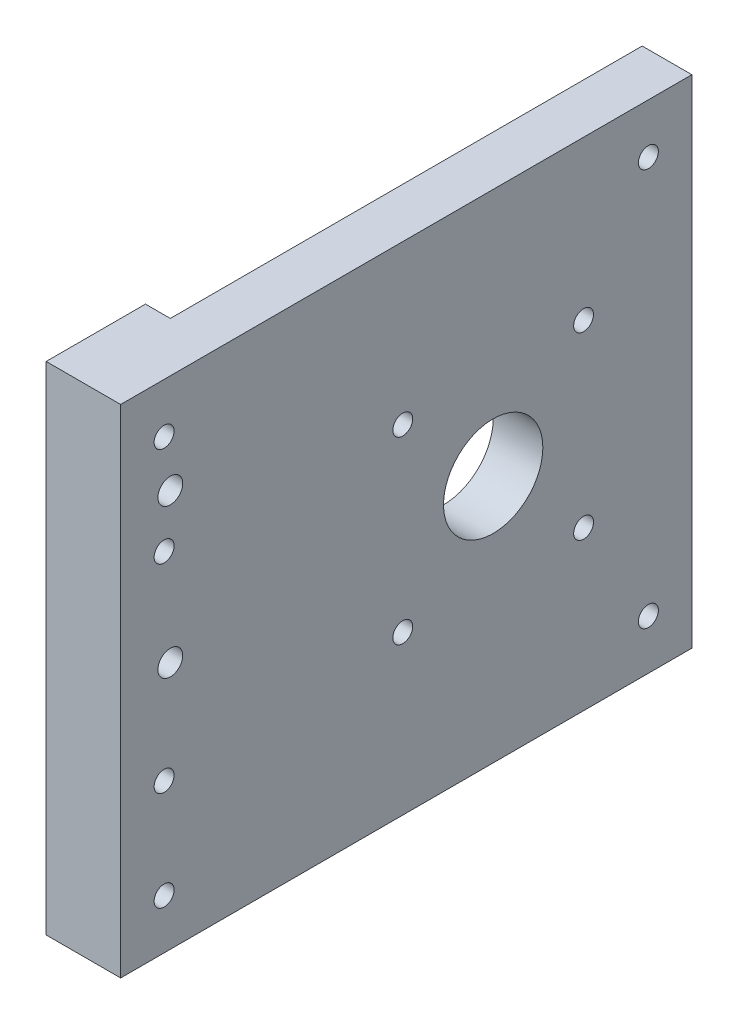
ISO-10303-21;
HEADER;
FILE_DESCRIPTION(('STEP AP214'),'2;1');
FILE_NAME('part.step','',(''),(''),'','','');
FILE_SCHEMA(('AUTOMOTIVE_DESIGN { 1 0 10303 214 1 1 1 1 }'));
ENDSEC;
DATA;
#1=APPLICATION_CONTEXT('core data for automotive mechanical design processes');
#2=APPLICATION_PROTOCOL_DEFINITION('international standard','automotive_design',2000,#1);
#3=PRODUCT_CONTEXT('',#1,'mechanical');
#4=PRODUCT('Part','Part','',(#3));
#5=PRODUCT_RELATED_PRODUCT_CATEGORY('part','',(#4));
#6=PRODUCT_DEFINITION_FORMATION('','',#4);
#7=PRODUCT_DEFINITION_CONTEXT('part definition',#1,'design');
#8=PRODUCT_DEFINITION('design','',#6,#7);
#9=PRODUCT_DEFINITION_SHAPE('','',#8);
#10=(LENGTH_UNIT() NAMED_UNIT(*) SI_UNIT(.MILLI.,.METRE.));
#11=(NAMED_UNIT(*) PLANE_ANGLE_UNIT() SI_UNIT($,.RADIAN.));
#12=(NAMED_UNIT(*) SI_UNIT($,.STERADIAN.) SOLID_ANGLE_UNIT());
#13=UNCERTAINTY_MEASURE_WITH_UNIT(LENGTH_MEASURE(1.E-05),#10,'distance_accuracy_value','');
#14=(GEOMETRIC_REPRESENTATION_CONTEXT(3) GLOBAL_UNCERTAINTY_ASSIGNED_CONTEXT((#13)) GLOBAL_UNIT_ASSIGNED_CONTEXT((#10,
#11,#12)) REPRESENTATION_CONTEXT('',''));
#15=CARTESIAN_POINT('',(0.,0.,0.));
#16=DIRECTION('',(0.,0.,1.));
#17=DIRECTION('',(1.,0.,0.));
#18=AXIS2_PLACEMENT_3D('',#15,#16,#17);
#19=CARTESIAN_POINT('',(0.,0.,146.05));
#20=DIRECTION('',(1.,0.,0.));
#21=DIRECTION('',(0.,0.,-1.));
#22=AXIS2_PLACEMENT_3D('',#19,#20,#21);
#23=PLANE('',#22);
#24=CARTESIAN_POINT('',(0.,114.3,11.1125));
#25=DIRECTION('',(-1.,0.,0.));
#26=DIRECTION('',(0.,0.,1.));
#27=AXIS2_PLACEMENT_3D('',#24,#25,#26);
#28=CIRCLE('',#27,2.55269999999999);
#29=CARTESIAN_POINT('',(0.,114.3,13.6652));
#30=VERTEX_POINT('',#29);
#31=EDGE_CURVE('E205',#30,#30,#28,.T.);
#32=ORIENTED_EDGE('',*,*,#31,.F.);
#33=EDGE_LOOP('',(#32));
#34=FACE_BOUND('',#33,.T.);
#35=CARTESIAN_POINT('',(0.,12.7,11.1125));
#36=DIRECTION('',(-1.,0.,0.));
#37=DIRECTION('',(0.,0.,1.));
#38=AXIS2_PLACEMENT_3D('',#35,#36,#37);
#39=CIRCLE('',#38,2.55269999999999);
#40=CARTESIAN_POINT('',(0.,12.7,13.6652));
#41=VERTEX_POINT('',#40);
#42=EDGE_CURVE('E209',#41,#41,#39,.T.);
#43=ORIENTED_EDGE('',*,*,#42,.F.);
#44=EDGE_LOOP('',(#43));
#45=FACE_BOUND('',#44,.T.);
#46=CARTESIAN_POINT('',(0.,40.513,73.914));
#47=DIRECTION('',(1.,0.,0.));
#48=DIRECTION('',(0.,0.,-1.));
#49=AXIS2_PLACEMENT_3D('',#46,#47,#48);
#50=CIRCLE('',#49,2.54);
#51=CARTESIAN_POINT('',(0.,40.513,71.374));
#52=VERTEX_POINT('',#51);
#53=EDGE_CURVE('E177',#52,#52,#50,.F.);
#54=ORIENTED_EDGE('',*,*,#53,.F.);
#55=EDGE_LOOP('',(#54));
#56=FACE_BOUND('',#55,.T.);
#57=CARTESIAN_POINT('',(0.,40.513,27.686));
#58=DIRECTION('',(1.,0.,0.));
#59=DIRECTION('',(0.,0.,-1.));
#60=AXIS2_PLACEMENT_3D('',#57,#58,#59);
#61=CIRCLE('',#60,2.54);
#62=CARTESIAN_POINT('',(0.,40.513,25.146));
#63=VERTEX_POINT('',#62);
#64=EDGE_CURVE('E171',#63,#63,#61,.F.);
#65=ORIENTED_EDGE('',*,*,#64,.F.);
#66=EDGE_LOOP('',(#65));
#67=FACE_BOUND('',#66,.T.);
#68=CARTESIAN_POINT('',(0.,86.487,27.686));
#69=DIRECTION('',(1.,0.,0.));
#70=DIRECTION('',(0.,0.,-1.));
#71=AXIS2_PLACEMENT_3D('',#68,#69,#70);
#72=CIRCLE('',#71,2.53999999999999);
#73=CARTESIAN_POINT('',(0.,86.487,25.146));
#74=VERTEX_POINT('',#73);
#75=EDGE_CURVE('E165',#74,#74,#72,.F.);
#76=ORIENTED_EDGE('',*,*,#75,.F.);
#77=EDGE_LOOP('',(#76));
#78=FACE_BOUND('',#77,.T.);
#79=CARTESIAN_POINT('',(0.,86.487,73.914));
#80=DIRECTION('',(1.,0.,0.));
#81=DIRECTION('',(0.,0.,-1.));
#82=AXIS2_PLACEMENT_3D('',#79,#80,#81);
#83=CIRCLE('',#82,2.53999999999999);
#84=CARTESIAN_POINT('',(0.,86.487,71.374));
#85=VERTEX_POINT('',#84);
#86=EDGE_CURVE('E159',#85,#85,#83,.F.);
#87=ORIENTED_EDGE('',*,*,#86,.F.);
#88=EDGE_LOOP('',(#87));
#89=FACE_BOUND('',#88,.T.);
#90=CARTESIAN_POINT('',(0.,63.5,50.8));
#91=DIRECTION('',(1.,0.,0.));
#92=DIRECTION('',(0.,0.,-1.));
#93=AXIS2_PLACEMENT_3D('',#90,#91,#92);
#94=CIRCLE('',#93,12.7);
#95=CARTESIAN_POINT('',(0.,63.5,38.1));
#96=VERTEX_POINT('',#95);
#97=EDGE_CURVE('E155',#96,#96,#94,.F.);
#98=ORIENTED_EDGE('',*,*,#97,.F.);
#99=EDGE_LOOP('',(#98));
#100=FACE_BOUND('',#99,.T.);
#101=DIRECTION('',(0.,-1.,0.));
#102=VECTOR('',#101,1.);
#103=CARTESIAN_POINT('',(0.,127.,120.65));
#104=LINE('',#103,#102);
#105=CARTESIAN_POINT('',(0.,127.,120.65));
#106=VERTEX_POINT('',#105);
#107=CARTESIAN_POINT('',(0.,0.,120.65));
#108=VERTEX_POINT('',#107);
#109=EDGE_CURVE('E50',#106,#108,#104,.T.);
#110=ORIENTED_EDGE('',*,*,#109,.F.);
#111=DIRECTION('',(0.,0.,-1.));
#112=VECTOR('',#111,1.);
#113=CARTESIAN_POINT('',(0.,127.,146.05));
#114=LINE('',#113,#112);
#115=CARTESIAN_POINT('',(0.,127.,0.));
#116=VERTEX_POINT('',#115);
#117=EDGE_CURVE('E74',#106,#116,#114,.T.);
#118=ORIENTED_EDGE('',*,*,#117,.T.);
#119=DIRECTION('',(0.,-1.,0.));
#120=VECTOR('',#119,1.);
#121=CARTESIAN_POINT('',(0.,0.,0.));
#122=LINE('',#121,#120);
#123=CARTESIAN_POINT('',(0.,0.,0.));
#124=VERTEX_POINT('',#123);
#125=EDGE_CURVE('E77',#116,#124,#122,.T.);
#126=ORIENTED_EDGE('',*,*,#125,.T.);
#127=DIRECTION('',(0.,0.,-1.));
#128=VECTOR('',#127,1.);
#129=CARTESIAN_POINT('',(0.,0.,146.05));
#130=LINE('',#129,#128);
#131=EDGE_CURVE('E11',#108,#124,#130,.T.);
#132=ORIENTED_EDGE('',*,*,#131,.F.);
#133=EDGE_LOOP('',(#110,#118,#126,#132));
#134=FACE_BOUND('',#133,.T.);
#135=ADVANCED_FACE('F36',(#34,#45,#56,#67,#78,#89,#100,#134),#23,.F.);
#136=CARTESIAN_POINT('',(0.,0.,146.05));
#137=DIRECTION('',(0.,1.,0.));
#138=DIRECTION('',(0.,0.,1.));
#139=AXIS2_PLACEMENT_3D('',#136,#137,#138);
#140=PLANE('',#139);
#141=DIRECTION('',(1.,0.,0.));
#142=VECTOR('',#141,1.);
#143=CARTESIAN_POINT('',(0.,0.,0.));
#144=LINE('',#143,#142);
#145=CARTESIAN_POINT('',(12.7,0.,0.));
#146=VERTEX_POINT('',#145);
#147=EDGE_CURVE('E96',#124,#146,#144,.T.);
#148=ORIENTED_EDGE('',*,*,#147,.T.);
#149=DIRECTION('',(0.,0.,-1.));
#150=VECTOR('',#149,1.);
#151=CARTESIAN_POINT('',(12.7,0.,146.05));
#152=LINE('',#151,#150);
#153=CARTESIAN_POINT('',(12.7,0.,146.05));
#154=VERTEX_POINT('',#153);
#155=EDGE_CURVE('E43',#154,#146,#152,.T.);
#156=ORIENTED_EDGE('',*,*,#155,.F.);
#157=DIRECTION('',(1.,0.,0.));
#158=VECTOR('',#157,1.);
#159=CARTESIAN_POINT('',(0.,0.,146.05));
#160=LINE('',#159,#158);
#161=CARTESIAN_POINT('',(-6.35,0.,146.05));
#162=VERTEX_POINT('',#161);
#163=EDGE_CURVE('E91',#162,#154,#160,.T.);
#164=ORIENTED_EDGE('',*,*,#163,.F.);
#165=DIRECTION('',(0.,0.,-1.));
#166=VECTOR('',#165,1.);
#167=CARTESIAN_POINT('',(-6.35,0.,146.05));
#168=LINE('',#167,#166);
#169=CARTESIAN_POINT('',(-6.35,0.,120.65));
#170=VERTEX_POINT('',#169);
#171=EDGE_CURVE('E144',#162,#170,#168,.T.);
#172=ORIENTED_EDGE('',*,*,#171,.T.);
#173=DIRECTION('',(1.,0.,0.));
#174=VECTOR('',#173,1.);
#175=CARTESIAN_POINT('',(-6.35,0.,120.65));
#176=LINE('',#175,#174);
#177=EDGE_CURVE('E119',#170,#108,#176,.T.);
#178=ORIENTED_EDGE('',*,*,#177,.T.);
#179=ORIENTED_EDGE('',*,*,#131,.T.);
#180=EDGE_LOOP('',(#148,#156,#164,#172,#178,#179));
#181=FACE_BOUND('',#180,.T.);
#182=ADVANCED_FACE('F113',(#181),#140,.F.);
#183=CARTESIAN_POINT('',(12.7,0.,146.05));
#184=DIRECTION('',(-1.,0.,0.));
#185=DIRECTION('',(0.,0.,1.));
#186=AXIS2_PLACEMENT_3D('',#183,#184,#185);
#187=PLANE('',#186);
#188=CARTESIAN_POINT('',(12.7,114.3,134.9375));
#189=DIRECTION('',(-1.,0.,0.));
#190=DIRECTION('',(0.,0.,1.));
#191=AXIS2_PLACEMENT_3D('',#188,#189,#190);
#192=CIRCLE('',#191,2.55269999999999);
#193=CARTESIAN_POINT('',(12.7,114.3,137.4902));
#194=VERTEX_POINT('',#193);
#195=EDGE_CURVE('E296',#194,#194,#192,.T.);
#196=ORIENTED_EDGE('',*,*,#195,.T.);
#197=EDGE_LOOP('',(#196));
#198=FACE_BOUND('',#197,.T.);
#199=CARTESIAN_POINT('',(12.7,88.9,134.9375));
#200=DIRECTION('',(-1.,0.,0.));
#201=DIRECTION('',(0.,0.,1.));
#202=AXIS2_PLACEMENT_3D('',#199,#200,#201);
#203=CIRCLE('',#202,2.55269999999999);
#204=CARTESIAN_POINT('',(12.7,88.9,137.4902));
#205=VERTEX_POINT('',#204);
#206=EDGE_CURVE('E306',#205,#205,#203,.T.);
#207=ORIENTED_EDGE('',*,*,#206,.T.);
#208=EDGE_LOOP('',(#207));
#209=FACE_BOUND('',#208,.T.);
#210=CARTESIAN_POINT('',(12.7,38.1,134.9375));
#211=DIRECTION('',(-1.,0.,0.));
#212=DIRECTION('',(0.,0.,1.));
#213=AXIS2_PLACEMENT_3D('',#210,#211,#212);
#214=CIRCLE('',#213,2.5527);
#215=CARTESIAN_POINT('',(12.7,38.1,137.4902));
#216=VERTEX_POINT('',#215);
#217=EDGE_CURVE('E312',#216,#216,#214,.T.);
#218=ORIENTED_EDGE('',*,*,#217,.T.);
#219=EDGE_LOOP('',(#218));
#220=FACE_BOUND('',#219,.T.);
#221=CARTESIAN_POINT('',(12.7,12.7,134.9375));
#222=DIRECTION('',(-1.,0.,0.));
#223=DIRECTION('',(0.,0.,1.));
#224=AXIS2_PLACEMENT_3D('',#221,#222,#223);
#225=CIRCLE('',#224,2.5527);
#226=CARTESIAN_POINT('',(12.7,12.7,137.4902));
#227=VERTEX_POINT('',#226);
#228=EDGE_CURVE('E318',#227,#227,#225,.T.);
#229=ORIENTED_EDGE('',*,*,#228,.T.);
#230=EDGE_LOOP('',(#229));
#231=FACE_BOUND('',#230,.T.);
#232=CARTESIAN_POINT('',(12.7,114.3,11.1125));
#233=DIRECTION('',(-1.,0.,0.));
#234=DIRECTION('',(0.,0.,1.));
#235=AXIS2_PLACEMENT_3D('',#232,#233,#234);
#236=CIRCLE('',#235,2.55269999999999);
#237=CARTESIAN_POINT('',(12.7,114.3,13.6652));
#238=VERTEX_POINT('',#237);
#239=EDGE_CURVE('E322',#238,#238,#236,.T.);
#240=ORIENTED_EDGE('',*,*,#239,.T.);
#241=EDGE_LOOP('',(#240));
#242=FACE_BOUND('',#241,.T.);
#243=CARTESIAN_POINT('',(12.7,12.7,11.1125));
#244=DIRECTION('',(-1.,0.,0.));
#245=DIRECTION('',(0.,0.,1.));
#246=AXIS2_PLACEMENT_3D('',#243,#244,#245);
#247=CIRCLE('',#246,2.5527);
#248=CARTESIAN_POINT('',(12.7,12.7,13.6652));
#249=VERTEX_POINT('',#248);
#250=EDGE_CURVE('E326',#249,#249,#247,.T.);
#251=ORIENTED_EDGE('',*,*,#250,.T.);
#252=EDGE_LOOP('',(#251));
#253=FACE_BOUND('',#252,.T.);
#254=CARTESIAN_POINT('',(12.7,101.6,133.35));
#255=DIRECTION('',(1.,0.,0.));
#256=DIRECTION('',(0.,0.,-1.));
#257=AXIS2_PLACEMENT_3D('',#254,#255,#256);
#258=CIRCLE('',#257,3.175);
#259=CARTESIAN_POINT('',(12.7,101.6,130.175));
#260=VERTEX_POINT('',#259);
#261=EDGE_CURVE('E97',#260,#260,#258,.T.);
#262=ORIENTED_EDGE('',*,*,#261,.F.);
#263=EDGE_LOOP('',(#262));
#264=FACE_BOUND('',#263,.T.);
#265=CARTESIAN_POINT('',(12.7,63.5,133.35));
#266=DIRECTION('',(1.,0.,0.));
#267=DIRECTION('',(0.,0.,-1.));
#268=AXIS2_PLACEMENT_3D('',#265,#266,#267);
#269=CIRCLE('',#268,3.175);
#270=CARTESIAN_POINT('',(12.7,63.5,130.175));
#271=VERTEX_POINT('',#270);
#272=EDGE_CURVE('E101',#271,#271,#269,.T.);
#273=ORIENTED_EDGE('',*,*,#272,.F.);
#274=EDGE_LOOP('',(#273));
#275=FACE_BOUND('',#274,.T.);
#276=CARTESIAN_POINT('',(12.7,63.5,50.8));
#277=DIRECTION('',(1.,0.,0.));
#278=DIRECTION('',(0.,0.,-1.));
#279=AXIS2_PLACEMENT_3D('',#276,#277,#278);
#280=CIRCLE('',#279,12.7);
#281=CARTESIAN_POINT('',(12.7,63.5,38.1));
#282=VERTEX_POINT('',#281);
#283=EDGE_CURVE('E156',#282,#282,#280,.T.);
#284=ORIENTED_EDGE('',*,*,#283,.F.);
#285=EDGE_LOOP('',(#284));
#286=FACE_BOUND('',#285,.T.);
#287=CARTESIAN_POINT('',(12.7,86.487,73.914));
#288=DIRECTION('',(1.,0.,0.));
#289=DIRECTION('',(0.,0.,-1.));
#290=AXIS2_PLACEMENT_3D('',#287,#288,#289);
#291=CIRCLE('',#290,2.53999999999999);
#292=CARTESIAN_POINT('',(12.7,86.487,71.374));
#293=VERTEX_POINT('',#292);
#294=EDGE_CURVE('E162',#293,#293,#291,.T.);
#295=ORIENTED_EDGE('',*,*,#294,.F.);
#296=EDGE_LOOP('',(#295));
#297=FACE_BOUND('',#296,.T.);
#298=CARTESIAN_POINT('',(12.7,86.487,27.686));
#299=DIRECTION('',(1.,0.,0.));
#300=DIRECTION('',(0.,0.,-1.));
#301=AXIS2_PLACEMENT_3D('',#298,#299,#300);
#302=CIRCLE('',#301,2.53999999999999);
#303=CARTESIAN_POINT('',(12.7,86.487,25.146));
#304=VERTEX_POINT('',#303);
#305=EDGE_CURVE('E168',#304,#304,#302,.T.);
#306=ORIENTED_EDGE('',*,*,#305,.F.);
#307=EDGE_LOOP('',(#306));
#308=FACE_BOUND('',#307,.T.);
#309=CARTESIAN_POINT('',(12.7,40.513,27.686));
#310=DIRECTION('',(1.,0.,0.));
#311=DIRECTION('',(0.,0.,-1.));
#312=AXIS2_PLACEMENT_3D('',#309,#310,#311);
#313=CIRCLE('',#312,2.54);
#314=CARTESIAN_POINT('',(12.7,40.513,25.146));
#315=VERTEX_POINT('',#314);
#316=EDGE_CURVE('E174',#315,#315,#313,.T.);
#317=ORIENTED_EDGE('',*,*,#316,.F.);
#318=EDGE_LOOP('',(#317));
#319=FACE_BOUND('',#318,.T.);
#320=CARTESIAN_POINT('',(12.7,40.513,73.914));
#321=DIRECTION('',(1.,0.,0.));
#322=DIRECTION('',(0.,0.,-1.));
#323=AXIS2_PLACEMENT_3D('',#320,#321,#322);
#324=CIRCLE('',#323,2.54);
#325=CARTESIAN_POINT('',(12.7,40.513,71.374));
#326=VERTEX_POINT('',#325);
#327=EDGE_CURVE('E141',#326,#326,#324,.T.);
#328=ORIENTED_EDGE('',*,*,#327,.F.);
#329=EDGE_LOOP('',(#328));
#330=FACE_BOUND('',#329,.T.);
#331=DIRECTION('',(0.,1.,0.));
#332=VECTOR('',#331,1.);
#333=CARTESIAN_POINT('',(12.7,0.,0.));
#334=LINE('',#333,#332);
#335=CARTESIAN_POINT('',(12.7,127.,0.));
#336=VERTEX_POINT('',#335);
#337=EDGE_CURVE('E92',#146,#336,#334,.T.);
#338=ORIENTED_EDGE('',*,*,#337,.T.);
#339=DIRECTION('',(0.,0.,-1.));
#340=VECTOR('',#339,1.);
#341=CARTESIAN_POINT('',(12.7,127.,146.05));
#342=LINE('',#341,#340);
#343=CARTESIAN_POINT('',(12.7,127.,146.05));
#344=VERTEX_POINT('',#343);
#345=EDGE_CURVE('E81',#344,#336,#342,.T.);
#346=ORIENTED_EDGE('',*,*,#345,.F.);
#347=DIRECTION('',(0.,1.,0.));
#348=VECTOR('',#347,1.);
#349=CARTESIAN_POINT('',(12.7,0.,146.05));
#350=LINE('',#349,#348);
#351=EDGE_CURVE('E59',#154,#344,#350,.T.);
#352=ORIENTED_EDGE('',*,*,#351,.F.);
#353=ORIENTED_EDGE('',*,*,#155,.T.);
#354=EDGE_LOOP('',(#338,#346,#352,#353));
#355=FACE_BOUND('',#354,.T.);
#356=ADVANCED_FACE('F110',(#198,#209,#220,#231,#242,#253,#264,#275,#286,#297,#308,#319,#330,
#355),#187,.F.);
#357=CARTESIAN_POINT('',(0.,127.,146.05));
#358=DIRECTION('',(0.,-1.,0.));
#359=DIRECTION('',(0.,0.,-1.));
#360=AXIS2_PLACEMENT_3D('',#357,#358,#359);
#361=PLANE('',#360);
#362=DIRECTION('',(-1.,0.,0.));
#363=VECTOR('',#362,1.);
#364=CARTESIAN_POINT('',(0.,127.,0.));
#365=LINE('',#364,#363);
#366=EDGE_CURVE('E86',#336,#116,#365,.T.);
#367=ORIENTED_EDGE('',*,*,#366,.T.);
#368=ORIENTED_EDGE('',*,*,#117,.F.);
#369=DIRECTION('',(1.,0.,0.));
#370=VECTOR('',#369,1.);
#371=CARTESIAN_POINT('',(-6.35,127.,120.65));
#372=LINE('',#371,#370);
#373=CARTESIAN_POINT('',(-6.35,127.,120.65));
#374=VERTEX_POINT('',#373);
#375=EDGE_CURVE('E139',#374,#106,#372,.T.);
#376=ORIENTED_EDGE('',*,*,#375,.F.);
#377=DIRECTION('',(0.,0.,-1.));
#378=VECTOR('',#377,1.);
#379=CARTESIAN_POINT('',(-6.35,127.,146.05));
#380=LINE('',#379,#378);
#381=CARTESIAN_POINT('',(-6.35,127.,146.05));
#382=VERTEX_POINT('',#381);
#383=EDGE_CURVE('E132',#382,#374,#380,.T.);
#384=ORIENTED_EDGE('',*,*,#383,.F.);
#385=DIRECTION('',(-1.,0.,0.));
#386=VECTOR('',#385,1.);
#387=CARTESIAN_POINT('',(0.,127.,146.05));
#388=LINE('',#387,#386);
#389=EDGE_CURVE('E82',#344,#382,#388,.T.);
#390=ORIENTED_EDGE('',*,*,#389,.F.);
#391=ORIENTED_EDGE('',*,*,#345,.T.);
#392=EDGE_LOOP('',(#367,#368,#376,#384,#390,#391));
#393=FACE_BOUND('',#392,.T.);
#394=ADVANCED_FACE('F87',(#393),#361,.F.);
#395=CARTESIAN_POINT('',(0.,0.,146.05));
#396=DIRECTION('',(0.,0.,-1.));
#397=DIRECTION('',(-1.,0.,0.));
#398=AXIS2_PLACEMENT_3D('',#395,#396,#397);
#399=PLANE('',#398);
#400=ORIENTED_EDGE('',*,*,#389,.T.);
#401=DIRECTION('',(0.,-1.,0.));
#402=VECTOR('',#401,1.);
#403=CARTESIAN_POINT('',(-6.35,127.,146.05));
#404=LINE('',#403,#402);
#405=EDGE_CURVE('E137',#382,#162,#404,.T.);
#406=ORIENTED_EDGE('',*,*,#405,.T.);
#407=ORIENTED_EDGE('',*,*,#163,.T.);
#408=ORIENTED_EDGE('',*,*,#351,.T.);
#409=EDGE_LOOP('',(#400,#406,#407,#408));
#410=FACE_BOUND('',#409,.T.);
#411=ADVANCED_FACE('F184',(#410),#399,.F.);
#412=CARTESIAN_POINT('',(0.,0.,0.));
#413=DIRECTION('',(0.,0.,-1.));
#414=DIRECTION('',(-1.,0.,0.));
#415=AXIS2_PLACEMENT_3D('',#412,#413,#414);
#416=PLANE('',#415);
#417=ORIENTED_EDGE('',*,*,#125,.F.);
#418=ORIENTED_EDGE('',*,*,#366,.F.);
#419=ORIENTED_EDGE('',*,*,#337,.F.);
#420=ORIENTED_EDGE('',*,*,#147,.F.);
#421=EDGE_LOOP('',(#417,#418,#419,#420));
#422=FACE_BOUND('',#421,.T.);
#423=ADVANCED_FACE('F95',(#422),#416,.T.);
#424=CARTESIAN_POINT('',(-35.9210244842766,40.513,73.914));
#425=DIRECTION('',(1.,0.,0.));
#426=DIRECTION('',(0.,0.,-1.));
#427=AXIS2_PLACEMENT_3D('',#424,#425,#426);
#428=CYLINDRICAL_SURFACE('',#427,2.54);
#429=ORIENTED_EDGE('',*,*,#53,.T.);
#430=EDGE_LOOP('',(#429));
#431=FACE_BOUND('',#430,.T.);
#432=ORIENTED_EDGE('',*,*,#327,.T.);
#433=EDGE_LOOP('',(#432));
#434=FACE_BOUND('',#433,.T.);
#435=ADVANCED_FACE('F191',(#431,#434),#428,.F.);
#436=CARTESIAN_POINT('',(-35.9210244842766,40.513,27.686));
#437=DIRECTION('',(1.,0.,0.));
#438=DIRECTION('',(0.,0.,-1.));
#439=AXIS2_PLACEMENT_3D('',#436,#437,#438);
#440=CYLINDRICAL_SURFACE('',#439,2.54);
#441=ORIENTED_EDGE('',*,*,#64,.T.);
#442=EDGE_LOOP('',(#441));
#443=FACE_BOUND('',#442,.T.);
#444=ORIENTED_EDGE('',*,*,#316,.T.);
#445=EDGE_LOOP('',(#444));
#446=FACE_BOUND('',#445,.T.);
#447=ADVANCED_FACE('F241',(#443,#446),#440,.F.);
#448=CARTESIAN_POINT('',(-35.9210244842766,86.487,27.686));
#449=DIRECTION('',(1.,0.,0.));
#450=DIRECTION('',(0.,0.,-1.));
#451=AXIS2_PLACEMENT_3D('',#448,#449,#450);
#452=CYLINDRICAL_SURFACE('',#451,2.53999999999999);
#453=ORIENTED_EDGE('',*,*,#75,.T.);
#454=EDGE_LOOP('',(#453));
#455=FACE_BOUND('',#454,.T.);
#456=ORIENTED_EDGE('',*,*,#305,.T.);
#457=EDGE_LOOP('',(#456));
#458=FACE_BOUND('',#457,.T.);
#459=ADVANCED_FACE('F246',(#455,#458),#452,.F.);
#460=CARTESIAN_POINT('',(-35.9210244842766,86.487,73.914));
#461=DIRECTION('',(1.,0.,0.));
#462=DIRECTION('',(0.,0.,-1.));
#463=AXIS2_PLACEMENT_3D('',#460,#461,#462);
#464=CYLINDRICAL_SURFACE('',#463,2.53999999999999);
#465=ORIENTED_EDGE('',*,*,#86,.T.);
#466=EDGE_LOOP('',(#465));
#467=FACE_BOUND('',#466,.T.);
#468=ORIENTED_EDGE('',*,*,#294,.T.);
#469=EDGE_LOOP('',(#468));
#470=FACE_BOUND('',#469,.T.);
#471=ADVANCED_FACE('F224',(#467,#470),#464,.F.);
#472=CARTESIAN_POINT('',(-35.9210244842766,63.5,50.8));
#473=DIRECTION('',(1.,0.,0.));
#474=DIRECTION('',(0.,0.,-1.));
#475=AXIS2_PLACEMENT_3D('',#472,#473,#474);
#476=CYLINDRICAL_SURFACE('',#475,12.7);
#477=ORIENTED_EDGE('',*,*,#97,.T.);
#478=EDGE_LOOP('',(#477));
#479=FACE_BOUND('',#478,.T.);
#480=ORIENTED_EDGE('',*,*,#283,.T.);
#481=EDGE_LOOP('',(#480));
#482=FACE_BOUND('',#481,.T.);
#483=ADVANCED_FACE('F220',(#479,#482),#476,.F.);
#484=CARTESIAN_POINT('',(-35.9210244842766,63.5,133.35));
#485=DIRECTION('',(1.,0.,0.));
#486=DIRECTION('',(0.,0.,-1.));
#487=AXIS2_PLACEMENT_3D('',#484,#485,#486);
#488=CYLINDRICAL_SURFACE('',#487,3.175);
#489=ORIENTED_EDGE('',*,*,#272,.T.);
#490=EDGE_LOOP('',(#489));
#491=FACE_BOUND('',#490,.T.);
#492=CARTESIAN_POINT('',(-6.35,63.5,133.35));
#493=DIRECTION('',(1.,0.,0.));
#494=DIRECTION('',(0.,0.,-1.));
#495=AXIS2_PLACEMENT_3D('',#492,#493,#494);
#496=CIRCLE('',#495,3.17499999999997);
#497=CARTESIAN_POINT('',(-6.35,63.5,130.175));
#498=VERTEX_POINT('',#497);
#499=EDGE_CURVE('E329',#498,#498,#496,.T.);
#500=ORIENTED_EDGE('',*,*,#499,.F.);
#501=EDGE_LOOP('',(#500));
#502=FACE_BOUND('',#501,.T.);
#503=ADVANCED_FACE('F223',(#491,#502),#488,.F.);
#504=CARTESIAN_POINT('',(-35.9210244842766,101.6,133.35));
#505=DIRECTION('',(1.,0.,0.));
#506=DIRECTION('',(0.,0.,-1.));
#507=AXIS2_PLACEMENT_3D('',#504,#505,#506);
#508=CYLINDRICAL_SURFACE('',#507,3.175);
#509=ORIENTED_EDGE('',*,*,#261,.T.);
#510=EDGE_LOOP('',(#509));
#511=FACE_BOUND('',#510,.T.);
#512=CARTESIAN_POINT('',(-6.35,101.6,133.35));
#513=DIRECTION('',(1.,0.,0.));
#514=DIRECTION('',(0.,0.,-1.));
#515=AXIS2_PLACEMENT_3D('',#512,#513,#514);
#516=CIRCLE('',#515,3.175);
#517=CARTESIAN_POINT('',(-6.35,101.6,130.175));
#518=VERTEX_POINT('',#517);
#519=EDGE_CURVE('E150',#518,#518,#516,.T.);
#520=ORIENTED_EDGE('',*,*,#519,.F.);
#521=EDGE_LOOP('',(#520));
#522=FACE_BOUND('',#521,.T.);
#523=ADVANCED_FACE('F258',(#511,#522),#508,.F.);
#524=CARTESIAN_POINT('',(-6.35,0.,0.));
#525=DIRECTION('',(-1.,0.,0.));
#526=DIRECTION('',(0.,0.,1.));
#527=AXIS2_PLACEMENT_3D('',#524,#525,#526);
#528=PLANE('',#527);
#529=CARTESIAN_POINT('',(-6.35,114.3,134.9375));
#530=DIRECTION('',(-1.,0.,0.));
#531=DIRECTION('',(0.,0.,1.));
#532=AXIS2_PLACEMENT_3D('',#529,#530,#531);
#533=CIRCLE('',#532,2.55269999999999);
#534=CARTESIAN_POINT('',(-6.35,114.3,137.4902));
#535=VERTEX_POINT('',#534);
#536=EDGE_CURVE('E299',#535,#535,#533,.T.);
#537=ORIENTED_EDGE('',*,*,#536,.F.);
#538=EDGE_LOOP('',(#537));
#539=FACE_BOUND('',#538,.T.);
#540=CARTESIAN_POINT('',(-6.35,88.9,134.9375));
#541=DIRECTION('',(-1.,0.,0.));
#542=DIRECTION('',(0.,0.,1.));
#543=AXIS2_PLACEMENT_3D('',#540,#541,#542);
#544=CIRCLE('',#543,2.55269999999999);
#545=CARTESIAN_POINT('',(-6.35,88.9,137.4902));
#546=VERTEX_POINT('',#545);
#547=EDGE_CURVE('E301',#546,#546,#544,.T.);
#548=ORIENTED_EDGE('',*,*,#547,.F.);
#549=EDGE_LOOP('',(#548));
#550=FACE_BOUND('',#549,.T.);
#551=CARTESIAN_POINT('',(-6.35,38.1,134.9375));
#552=DIRECTION('',(-1.,0.,0.));
#553=DIRECTION('',(0.,0.,1.));
#554=AXIS2_PLACEMENT_3D('',#551,#552,#553);
#555=CIRCLE('',#554,2.55269999999999);
#556=CARTESIAN_POINT('',(-6.35,38.1,137.4902));
#557=VERTEX_POINT('',#556);
#558=EDGE_CURVE('E309',#557,#557,#555,.T.);
#559=ORIENTED_EDGE('',*,*,#558,.F.);
#560=EDGE_LOOP('',(#559));
#561=FACE_BOUND('',#560,.T.);
#562=CARTESIAN_POINT('',(-6.35,12.7,134.9375));
#563=DIRECTION('',(-1.,0.,0.));
#564=DIRECTION('',(0.,0.,1.));
#565=AXIS2_PLACEMENT_3D('',#562,#563,#564);
#566=CIRCLE('',#565,2.55269999999999);
#567=CARTESIAN_POINT('',(-6.35,12.7,137.4902));
#568=VERTEX_POINT('',#567);
#569=EDGE_CURVE('E315',#568,#568,#566,.T.);
#570=ORIENTED_EDGE('',*,*,#569,.F.);
#571=EDGE_LOOP('',(#570));
#572=FACE_BOUND('',#571,.T.);
#573=ORIENTED_EDGE('',*,*,#519,.T.);
#574=EDGE_LOOP('',(#573));
#575=FACE_BOUND('',#574,.T.);
#576=ORIENTED_EDGE('',*,*,#499,.T.);
#577=EDGE_LOOP('',(#576));
#578=FACE_BOUND('',#577,.T.);
#579=ORIENTED_EDGE('',*,*,#171,.F.);
#580=ORIENTED_EDGE('',*,*,#405,.F.);
#581=ORIENTED_EDGE('',*,*,#383,.T.);
#582=DIRECTION('',(0.,-1.,0.));
#583=VECTOR('',#582,1.);
#584=CARTESIAN_POINT('',(-6.35,127.,120.65));
#585=LINE('',#584,#583);
#586=EDGE_CURVE('E135',#374,#170,#585,.T.);
#587=ORIENTED_EDGE('',*,*,#586,.T.);
#588=EDGE_LOOP('',(#579,#580,#581,#587));
#589=FACE_BOUND('',#588,.T.);
#590=ADVANCED_FACE('F133',(#539,#550,#561,#572,#575,#578,#589),#528,.T.);
#591=CARTESIAN_POINT('',(-6.35,127.,120.65));
#592=DIRECTION('',(0.,0.,1.));
#593=DIRECTION('',(0.,-1.,0.));
#594=AXIS2_PLACEMENT_3D('',#591,#592,#593);
#595=PLANE('',#594);
#596=ORIENTED_EDGE('',*,*,#109,.T.);
#597=ORIENTED_EDGE('',*,*,#177,.F.);
#598=ORIENTED_EDGE('',*,*,#586,.F.);
#599=ORIENTED_EDGE('',*,*,#375,.T.);
#600=EDGE_LOOP('',(#596,#597,#598,#599));
#601=FACE_BOUND('',#600,.T.);
#602=ADVANCED_FACE('F143',(#601),#595,.F.);
#603=CARTESIAN_POINT('',(0.,12.7,11.1125));
#604=DIRECTION('',(-1.,0.,0.));
#605=DIRECTION('',(0.,0.,1.));
#606=AXIS2_PLACEMENT_3D('',#603,#604,#605);
#607=CYLINDRICAL_SURFACE('',#606,2.55269999999999);
#608=ORIENTED_EDGE('',*,*,#250,.F.);
#609=EDGE_LOOP('',(#608));
#610=FACE_BOUND('',#609,.T.);
#611=ORIENTED_EDGE('',*,*,#42,.T.);
#612=EDGE_LOOP('',(#611));
#613=FACE_BOUND('',#612,.T.);
#614=ADVANCED_FACE('F265',(#610,#613),#607,.F.);
#615=CARTESIAN_POINT('',(0.,114.3,11.1125));
#616=DIRECTION('',(-1.,0.,0.));
#617=DIRECTION('',(0.,0.,1.));
#618=AXIS2_PLACEMENT_3D('',#615,#616,#617);
#619=CYLINDRICAL_SURFACE('',#618,2.55269999999999);
#620=ORIENTED_EDGE('',*,*,#239,.F.);
#621=EDGE_LOOP('',(#620));
#622=FACE_BOUND('',#621,.T.);
#623=ORIENTED_EDGE('',*,*,#31,.T.);
#624=EDGE_LOOP('',(#623));
#625=FACE_BOUND('',#624,.T.);
#626=ADVANCED_FACE('F271',(#622,#625),#619,.F.);
#627=CARTESIAN_POINT('',(-6.35,12.7,134.9375));
#628=DIRECTION('',(-1.,0.,0.));
#629=DIRECTION('',(0.,0.,1.));
#630=AXIS2_PLACEMENT_3D('',#627,#628,#629);
#631=CYLINDRICAL_SURFACE('',#630,2.55269999999999);
#632=ORIENTED_EDGE('',*,*,#228,.F.);
#633=EDGE_LOOP('',(#632));
#634=FACE_BOUND('',#633,.T.);
#635=ORIENTED_EDGE('',*,*,#569,.T.);
#636=EDGE_LOOP('',(#635));
#637=FACE_BOUND('',#636,.T.);
#638=ADVANCED_FACE('F275',(#634,#637),#631,.F.);
#639=CARTESIAN_POINT('',(-6.35,38.1,134.9375));
#640=DIRECTION('',(-1.,0.,0.));
#641=DIRECTION('',(0.,0.,1.));
#642=AXIS2_PLACEMENT_3D('',#639,#640,#641);
#643=CYLINDRICAL_SURFACE('',#642,2.55269999999999);
#644=ORIENTED_EDGE('',*,*,#217,.F.);
#645=EDGE_LOOP('',(#644));
#646=FACE_BOUND('',#645,.T.);
#647=ORIENTED_EDGE('',*,*,#558,.T.);
#648=EDGE_LOOP('',(#647));
#649=FACE_BOUND('',#648,.T.);
#650=ADVANCED_FACE('F279',(#646,#649),#643,.F.);
#651=CARTESIAN_POINT('',(-6.35,88.9,134.9375));
#652=DIRECTION('',(-1.,0.,0.));
#653=DIRECTION('',(0.,0.,1.));
#654=AXIS2_PLACEMENT_3D('',#651,#652,#653);
#655=CYLINDRICAL_SURFACE('',#654,2.55269999999999);
#656=ORIENTED_EDGE('',*,*,#206,.F.);
#657=EDGE_LOOP('',(#656));
#658=FACE_BOUND('',#657,.T.);
#659=ORIENTED_EDGE('',*,*,#547,.T.);
#660=EDGE_LOOP('',(#659));
#661=FACE_BOUND('',#660,.T.);
#662=ADVANCED_FACE('F283',(#658,#661),#655,.F.);
#663=CARTESIAN_POINT('',(-6.35,114.3,134.9375));
#664=DIRECTION('',(-1.,0.,0.));
#665=DIRECTION('',(0.,0.,1.));
#666=AXIS2_PLACEMENT_3D('',#663,#664,#665);
#667=CYLINDRICAL_SURFACE('',#666,2.55269999999999);
#668=ORIENTED_EDGE('',*,*,#195,.F.);
#669=EDGE_LOOP('',(#668));
#670=FACE_BOUND('',#669,.T.);
#671=ORIENTED_EDGE('',*,*,#536,.T.);
#672=EDGE_LOOP('',(#671));
#673=FACE_BOUND('',#672,.T.);
#674=ADVANCED_FACE('F287',(#670,#673),#667,.F.);
#675=CLOSED_SHELL('',(#135,#182,#356,#394,#411,#423,#435,#447,#459,#471,#483,#503,#523,#590,
#602,#614,#626,#638,#650,#662,#674));
#676=MANIFOLD_SOLID_BREP('B2',#675);
#677=ADVANCED_BREP_SHAPE_REPRESENTATION('',(#18,#676),#14);
#678=SHAPE_DEFINITION_REPRESENTATION(#9,#677);
ENDSEC;
END-ISO-10303-21;
